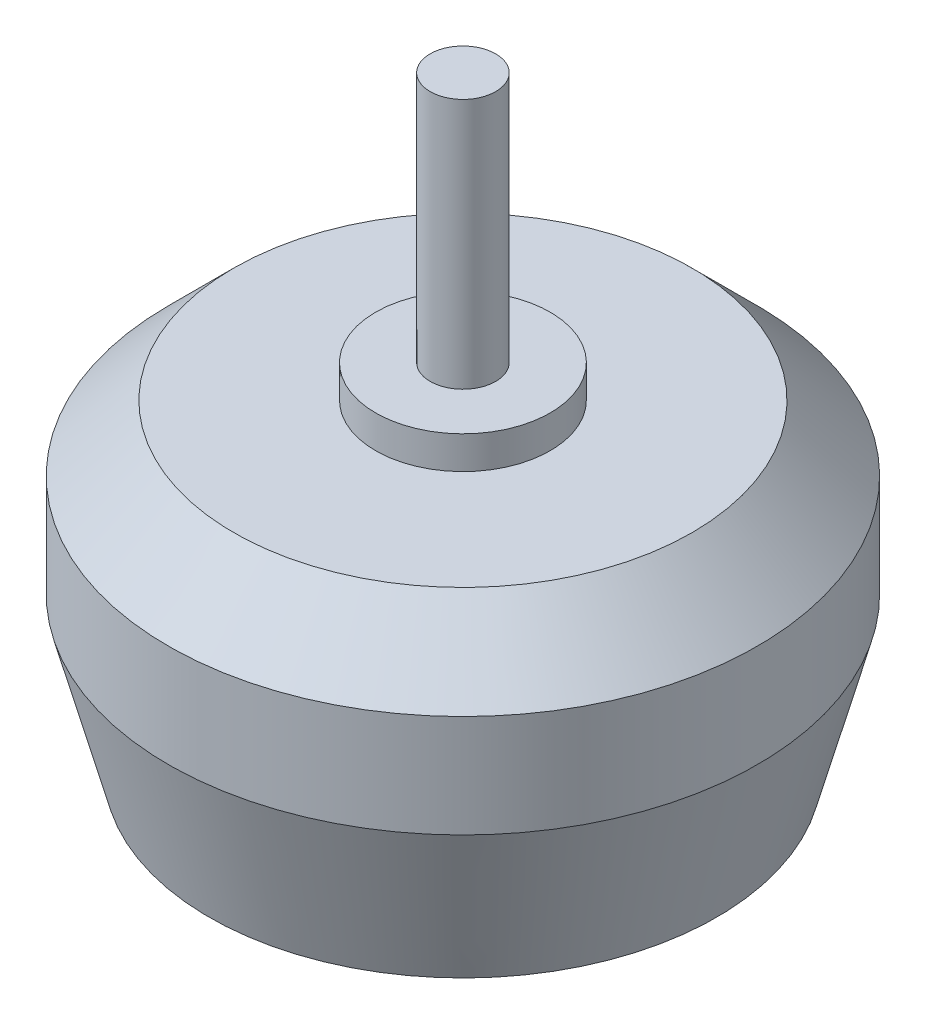
ISO-10303-21;
HEADER;
FILE_DESCRIPTION(('STEP AP214'),'2;1');
FILE_NAME('part.step','',(''),(''),'','','');
FILE_SCHEMA(('AUTOMOTIVE_DESIGN { 1 0 10303 214 1 1 1 1 }'));
ENDSEC;
DATA;
#1=APPLICATION_CONTEXT('core data for automotive mechanical design processes');
#2=APPLICATION_PROTOCOL_DEFINITION('international standard','automotive_design',2000,#1);
#3=PRODUCT_CONTEXT('',#1,'mechanical');
#4=PRODUCT('Part','Part','',(#3));
#5=PRODUCT_RELATED_PRODUCT_CATEGORY('part','',(#4));
#6=PRODUCT_DEFINITION_FORMATION('','',#4);
#7=PRODUCT_DEFINITION_CONTEXT('part definition',#1,'design');
#8=PRODUCT_DEFINITION('design','',#6,#7);
#9=PRODUCT_DEFINITION_SHAPE('','',#8);
#10=(LENGTH_UNIT() NAMED_UNIT(*) SI_UNIT(.MILLI.,.METRE.));
#11=(NAMED_UNIT(*) PLANE_ANGLE_UNIT() SI_UNIT($,.RADIAN.));
#12=(NAMED_UNIT(*) SI_UNIT($,.STERADIAN.) SOLID_ANGLE_UNIT());
#13=UNCERTAINTY_MEASURE_WITH_UNIT(LENGTH_MEASURE(1.E-05),#10,'distance_accuracy_value','');
#14=(GEOMETRIC_REPRESENTATION_CONTEXT(3) GLOBAL_UNCERTAINTY_ASSIGNED_CONTEXT((#13)) GLOBAL_UNIT_ASSIGNED_CONTEXT((#10,
#11,#12)) REPRESENTATION_CONTEXT('',''));
#15=CARTESIAN_POINT('',(0.,0.,0.));
#16=DIRECTION('',(0.,0.,1.));
#17=DIRECTION('',(1.,0.,0.));
#18=AXIS2_PLACEMENT_3D('',#15,#16,#17);
#19=CARTESIAN_POINT('',(0.,-2.1,0.));
#20=DIRECTION('',(0.,1.,0.));
#21=DIRECTION('',(-1.,0.,0.));
#22=AXIS2_PLACEMENT_3D('',#19,#20,#21);
#23=CYLINDRICAL_SURFACE('',#22,1.5);
#24=CARTESIAN_POINT('',(0.,0.,0.));
#25=DIRECTION('',(0.,1.,0.));
#26=DIRECTION('',(-1.,0.,0.));
#27=AXIS2_PLACEMENT_3D('',#24,#25,#26);
#28=CIRCLE('',#27,1.5);
#29=CARTESIAN_POINT('',(-1.5,0.,0.));
#30=VERTEX_POINT('',#29);
#31=EDGE_CURVE('E67',#30,#30,#28,.T.);
#32=ORIENTED_EDGE('',*,*,#31,.F.);
#33=EDGE_LOOP('',(#32));
#34=FACE_BOUND('',#33,.T.);
#35=CARTESIAN_POINT('',(0.,-2.1,0.));
#36=DIRECTION('',(0.,1.,0.));
#37=DIRECTION('',(-1.,0.,0.));
#38=AXIS2_PLACEMENT_3D('',#35,#36,#37);
#39=CIRCLE('',#38,1.5);
#40=CARTESIAN_POINT('',(-1.5,-2.1,0.));
#41=VERTEX_POINT('',#40);
#42=EDGE_CURVE('E10',#41,#41,#39,.T.);
#43=ORIENTED_EDGE('',*,*,#42,.T.);
#44=EDGE_LOOP('',(#43));
#45=FACE_BOUND('',#44,.T.);
#46=ADVANCED_FACE('F33',(#34,#45),#23,.T.);
#47=CARTESIAN_POINT('',(0.,-2.1,0.));
#48=DIRECTION('',(0.,1.,0.));
#49=DIRECTION('',(-1.,0.,0.));
#50=AXIS2_PLACEMENT_3D('',#47,#48,#49);
#51=PLANE('',#50);
#52=ORIENTED_EDGE('',*,*,#42,.F.);
#53=EDGE_LOOP('',(#52));
#54=FACE_BOUND('',#53,.T.);
#55=ADVANCED_FACE('F121',(#54),#51,.F.);
#56=CARTESIAN_POINT('',(1.5,27.7,0.));
#57=DIRECTION('',(0.,-1.,0.));
#58=DIRECTION('',(1.,0.,0.));
#59=AXIS2_PLACEMENT_3D('',#56,#57,#58);
#60=PLANE('',#59);
#61=CARTESIAN_POINT('',(0.,27.7,0.));
#62=DIRECTION('',(0.,1.,0.));
#63=DIRECTION('',(-1.,0.,0.));
#64=AXIS2_PLACEMENT_3D('',#61,#62,#63);
#65=CIRCLE('',#64,1.5);
#66=CARTESIAN_POINT('',(-1.5,27.7,0.));
#67=VERTEX_POINT('',#66);
#68=EDGE_CURVE('E39',#67,#67,#65,.T.);
#69=ORIENTED_EDGE('',*,*,#68,.T.);
#70=EDGE_LOOP('',(#69));
#71=FACE_BOUND('',#70,.T.);
#72=ADVANCED_FACE('F125',(#71),#60,.F.);
#73=CARTESIAN_POINT('',(0.,-2.1,0.));
#74=DIRECTION('',(0.,1.,0.));
#75=DIRECTION('',(-1.,0.,0.));
#76=AXIS2_PLACEMENT_3D('',#73,#74,#75);
#77=CYLINDRICAL_SURFACE('',#76,1.5);
#78=ORIENTED_EDGE('',*,*,#68,.F.);
#79=EDGE_LOOP('',(#78));
#80=FACE_BOUND('',#79,.T.);
#81=CARTESIAN_POINT('',(0.,16.2,0.));
#82=DIRECTION('',(0.,1.,0.));
#83=DIRECTION('',(-1.,0.,0.));
#84=AXIS2_PLACEMENT_3D('',#81,#82,#83);
#85=CIRCLE('',#84,1.5);
#86=CARTESIAN_POINT('',(-1.5,16.2,0.));
#87=VERTEX_POINT('',#86);
#88=EDGE_CURVE('E43',#87,#87,#85,.T.);
#89=ORIENTED_EDGE('',*,*,#88,.T.);
#90=EDGE_LOOP('',(#89));
#91=FACE_BOUND('',#90,.T.);
#92=ADVANCED_FACE('F130',(#80,#91),#77,.T.);
#93=CARTESIAN_POINT('',(4.,16.2,0.));
#94=DIRECTION('',(0.,-1.,0.));
#95=DIRECTION('',(1.,0.,0.));
#96=AXIS2_PLACEMENT_3D('',#93,#94,#95);
#97=PLANE('',#96);
#98=ORIENTED_EDGE('',*,*,#88,.F.);
#99=EDGE_LOOP('',(#98));
#100=FACE_BOUND('',#99,.T.);
#101=CARTESIAN_POINT('',(0.,16.2,0.));
#102=DIRECTION('',(0.,1.,0.));
#103=DIRECTION('',(-1.,0.,0.));
#104=AXIS2_PLACEMENT_3D('',#101,#102,#103);
#105=CIRCLE('',#104,4.);
#106=CARTESIAN_POINT('',(-4.,16.2,0.));
#107=VERTEX_POINT('',#106);
#108=EDGE_CURVE('E47',#107,#107,#105,.T.);
#109=ORIENTED_EDGE('',*,*,#108,.T.);
#110=EDGE_LOOP('',(#109));
#111=FACE_BOUND('',#110,.T.);
#112=ADVANCED_FACE('F135',(#100,#111),#97,.F.);
#113=CARTESIAN_POINT('',(0.,-2.1,0.));
#114=DIRECTION('',(0.,1.,0.));
#115=DIRECTION('',(-1.,0.,0.));
#116=AXIS2_PLACEMENT_3D('',#113,#114,#115);
#117=CYLINDRICAL_SURFACE('',#116,4.);
#118=ORIENTED_EDGE('',*,*,#108,.F.);
#119=EDGE_LOOP('',(#118));
#120=FACE_BOUND('',#119,.T.);
#121=CARTESIAN_POINT('',(0.,14.7,0.));
#122=DIRECTION('',(0.,1.,0.));
#123=DIRECTION('',(-1.,0.,0.));
#124=AXIS2_PLACEMENT_3D('',#121,#122,#123);
#125=CIRCLE('',#124,4.);
#126=CARTESIAN_POINT('',(-4.,14.7,0.));
#127=VERTEX_POINT('',#126);
#128=EDGE_CURVE('E52',#127,#127,#125,.T.);
#129=ORIENTED_EDGE('',*,*,#128,.T.);
#130=EDGE_LOOP('',(#129));
#131=FACE_BOUND('',#130,.T.);
#132=ADVANCED_FACE('F139',(#120,#131),#117,.T.);
#133=CARTESIAN_POINT('',(10.5,14.7,0.));
#134=DIRECTION('',(0.,-1.,0.));
#135=DIRECTION('',(1.,0.,0.));
#136=AXIS2_PLACEMENT_3D('',#133,#134,#135);
#137=PLANE('',#136);
#138=ORIENTED_EDGE('',*,*,#128,.F.);
#139=EDGE_LOOP('',(#138));
#140=FACE_BOUND('',#139,.T.);
#141=CARTESIAN_POINT('',(0.,14.7,0.));
#142=DIRECTION('',(0.,1.,0.));
#143=DIRECTION('',(-1.,0.,0.));
#144=AXIS2_PLACEMENT_3D('',#141,#142,#143);
#145=CIRCLE('',#144,10.5);
#146=CARTESIAN_POINT('',(-10.5,14.7,0.));
#147=VERTEX_POINT('',#146);
#148=EDGE_CURVE('E55',#147,#147,#145,.T.);
#149=ORIENTED_EDGE('',*,*,#148,.T.);
#150=EDGE_LOOP('',(#149));
#151=FACE_BOUND('',#150,.T.);
#152=ADVANCED_FACE('F143',(#140,#151),#137,.F.);
#153=CARTESIAN_POINT('',(0.,11.7,0.));
#154=DIRECTION('',(0.,-1.,0.));
#155=DIRECTION('',(1.,0.,0.));
#156=AXIS2_PLACEMENT_3D('',#153,#154,#155);
#157=CONICAL_SURFACE('',#156,13.5,0.78539816339745);
#158=ORIENTED_EDGE('',*,*,#148,.F.);
#159=EDGE_LOOP('',(#158));
#160=FACE_BOUND('',#159,.T.);
#161=CARTESIAN_POINT('',(0.,11.7,0.));
#162=DIRECTION('',(0.,1.,0.));
#163=DIRECTION('',(-1.,0.,0.));
#164=AXIS2_PLACEMENT_3D('',#161,#162,#163);
#165=CIRCLE('',#164,13.5);
#166=CARTESIAN_POINT('',(-13.5,11.7,0.));
#167=VERTEX_POINT('',#166);
#168=EDGE_CURVE('E58',#167,#167,#165,.T.);
#169=ORIENTED_EDGE('',*,*,#168,.T.);
#170=EDGE_LOOP('',(#169));
#171=FACE_BOUND('',#170,.T.);
#172=ADVANCED_FACE('F147',(#160,#171),#157,.T.);
#173=CARTESIAN_POINT('',(0.,-2.1,0.));
#174=DIRECTION('',(0.,1.,0.));
#175=DIRECTION('',(-1.,0.,0.));
#176=AXIS2_PLACEMENT_3D('',#173,#174,#175);
#177=CYLINDRICAL_SURFACE('',#176,13.5);
#178=ORIENTED_EDGE('',*,*,#168,.F.);
#179=EDGE_LOOP('',(#178));
#180=FACE_BOUND('',#179,.T.);
#181=CARTESIAN_POINT('',(0.,7.,0.));
#182=DIRECTION('',(0.,1.,0.));
#183=DIRECTION('',(-1.,0.,0.));
#184=AXIS2_PLACEMENT_3D('',#181,#182,#183);
#185=CIRCLE('',#184,13.5);
#186=CARTESIAN_POINT('',(-13.5,7.,0.));
#187=VERTEX_POINT('',#186);
#188=EDGE_CURVE('E61',#187,#187,#185,.T.);
#189=ORIENTED_EDGE('',*,*,#188,.T.);
#190=EDGE_LOOP('',(#189));
#191=FACE_BOUND('',#190,.T.);
#192=ADVANCED_FACE('F151',(#180,#191),#177,.T.);
#193=CARTESIAN_POINT('',(0.,0.,0.));
#194=DIRECTION('',(0.,1.,0.));
#195=DIRECTION('',(-1.,0.,0.));
#196=AXIS2_PLACEMENT_3D('',#193,#194,#195);
#197=CONICAL_SURFACE('',#196,11.6243556529822,0.261799387799146);
#198=ORIENTED_EDGE('',*,*,#188,.F.);
#199=EDGE_LOOP('',(#198));
#200=FACE_BOUND('',#199,.T.);
#201=CARTESIAN_POINT('',(0.,0.,0.));
#202=DIRECTION('',(0.,1.,0.));
#203=DIRECTION('',(-1.,0.,0.));
#204=AXIS2_PLACEMENT_3D('',#201,#202,#203);
#205=CIRCLE('',#204,11.6243556529822);
#206=CARTESIAN_POINT('',(-11.6243556529822,0.,0.));
#207=VERTEX_POINT('',#206);
#208=EDGE_CURVE('E64',#207,#207,#205,.T.);
#209=ORIENTED_EDGE('',*,*,#208,.T.);
#210=EDGE_LOOP('',(#209));
#211=FACE_BOUND('',#210,.T.);
#212=ADVANCED_FACE('F108',(#200,#211),#197,.T.);
#213=CARTESIAN_POINT('',(1.5,0.,0.));
#214=DIRECTION('',(0.,1.,0.));
#215=DIRECTION('',(-1.,0.,0.));
#216=AXIS2_PLACEMENT_3D('',#213,#214,#215);
#217=PLANE('',#216);
#218=CARTESIAN_POINT('',(8.,0.,0.));
#219=DIRECTION('',(0.,-1.,0.));
#220=DIRECTION('',(1.,0.,0.));
#221=AXIS2_PLACEMENT_3D('',#218,#219,#220);
#222=CIRCLE('',#221,1.375);
#223=CARTESIAN_POINT('',(9.375,0.,0.));
#224=VERTEX_POINT('',#223);
#225=EDGE_CURVE('E89',#224,#224,#222,.T.);
#226=ORIENTED_EDGE('',*,*,#225,.F.);
#227=EDGE_LOOP('',(#226));
#228=FACE_BOUND('',#227,.T.);
#229=CARTESIAN_POINT('',(-8.,0.,0.));
#230=DIRECTION('',(0.,-1.,0.));
#231=DIRECTION('',(1.,0.,0.));
#232=AXIS2_PLACEMENT_3D('',#229,#230,#231);
#233=CIRCLE('',#232,1.375);
#234=CARTESIAN_POINT('',(-6.625,0.,0.));
#235=VERTEX_POINT('',#234);
#236=EDGE_CURVE('E83',#235,#235,#233,.T.);
#237=ORIENTED_EDGE('',*,*,#236,.F.);
#238=EDGE_LOOP('',(#237));
#239=FACE_BOUND('',#238,.T.);
#240=CARTESIAN_POINT('',(0.,0.,-9.5));
#241=DIRECTION('',(0.,-1.,0.));
#242=DIRECTION('',(1.,0.,0.));
#243=AXIS2_PLACEMENT_3D('',#240,#241,#242);
#244=CIRCLE('',#243,1.375);
#245=CARTESIAN_POINT('',(1.375,0.,-9.5));
#246=VERTEX_POINT('',#245);
#247=EDGE_CURVE('E77',#246,#246,#244,.T.);
#248=ORIENTED_EDGE('',*,*,#247,.F.);
#249=EDGE_LOOP('',(#248));
#250=FACE_BOUND('',#249,.T.);
#251=CARTESIAN_POINT('',(0.,0.,9.5));
#252=DIRECTION('',(0.,-1.,0.));
#253=DIRECTION('',(1.,0.,0.));
#254=AXIS2_PLACEMENT_3D('',#251,#252,#253);
#255=CIRCLE('',#254,1.375);
#256=CARTESIAN_POINT('',(1.375,0.,9.5));
#257=VERTEX_POINT('',#256);
#258=EDGE_CURVE('E71',#257,#257,#255,.T.);
#259=ORIENTED_EDGE('',*,*,#258,.F.);
#260=EDGE_LOOP('',(#259));
#261=FACE_BOUND('',#260,.T.);
#262=ORIENTED_EDGE('',*,*,#208,.F.);
#263=EDGE_LOOP('',(#262));
#264=FACE_BOUND('',#263,.T.);
#265=ORIENTED_EDGE('',*,*,#31,.T.);
#266=EDGE_LOOP('',(#265));
#267=FACE_BOUND('',#266,.T.);
#268=ADVANCED_FACE('F104',(#228,#239,#250,#261,#264,#267),#217,.F.);
#269=CARTESIAN_POINT('',(0.,2.,9.5));
#270=DIRECTION('',(0.,-1.,0.));
#271=DIRECTION('',(1.,0.,0.));
#272=AXIS2_PLACEMENT_3D('',#269,#270,#271);
#273=CYLINDRICAL_SURFACE('',#272,1.375);
#274=CARTESIAN_POINT('',(0.,2.,9.5));
#275=DIRECTION('',(0.,-1.,0.));
#276=DIRECTION('',(1.,0.,0.));
#277=AXIS2_PLACEMENT_3D('',#274,#275,#276);
#278=CIRCLE('',#277,1.375);
#279=CARTESIAN_POINT('',(1.375,2.,9.5));
#280=VERTEX_POINT('',#279);
#281=EDGE_CURVE('E70',#280,#280,#278,.T.);
#282=ORIENTED_EDGE('',*,*,#281,.F.);
#283=EDGE_LOOP('',(#282));
#284=FACE_BOUND('',#283,.T.);
#285=ORIENTED_EDGE('',*,*,#258,.T.);
#286=EDGE_LOOP('',(#285));
#287=FACE_BOUND('',#286,.T.);
#288=ADVANCED_FACE('F107',(#284,#287),#273,.F.);
#289=CARTESIAN_POINT('',(0.,2.,9.5));
#290=DIRECTION('',(0.,-1.,0.));
#291=DIRECTION('',(1.,0.,0.));
#292=AXIS2_PLACEMENT_3D('',#289,#290,#291);
#293=PLANE('',#292);
#294=ORIENTED_EDGE('',*,*,#281,.T.);
#295=EDGE_LOOP('',(#294));
#296=FACE_BOUND('',#295,.T.);
#297=ADVANCED_FACE('F161',(#296),#293,.T.);
#298=CARTESIAN_POINT('',(0.,2.,-9.5));
#299=DIRECTION('',(0.,-1.,0.));
#300=DIRECTION('',(1.,0.,0.));
#301=AXIS2_PLACEMENT_3D('',#298,#299,#300);
#302=CYLINDRICAL_SURFACE('',#301,1.375);
#303=CARTESIAN_POINT('',(0.,2.,-9.5));
#304=DIRECTION('',(0.,-1.,0.));
#305=DIRECTION('',(1.,0.,0.));
#306=AXIS2_PLACEMENT_3D('',#303,#304,#305);
#307=CIRCLE('',#306,1.375);
#308=CARTESIAN_POINT('',(1.375,2.,-9.5));
#309=VERTEX_POINT('',#308);
#310=EDGE_CURVE('E74',#309,#309,#307,.T.);
#311=ORIENTED_EDGE('',*,*,#310,.F.);
#312=EDGE_LOOP('',(#311));
#313=FACE_BOUND('',#312,.T.);
#314=ORIENTED_EDGE('',*,*,#247,.T.);
#315=EDGE_LOOP('',(#314));
#316=FACE_BOUND('',#315,.T.);
#317=ADVANCED_FACE('F165',(#313,#316),#302,.F.);
#318=CARTESIAN_POINT('',(0.,2.,-9.5));
#319=DIRECTION('',(0.,-1.,0.));
#320=DIRECTION('',(1.,0.,0.));
#321=AXIS2_PLACEMENT_3D('',#318,#319,#320);
#322=PLANE('',#321);
#323=ORIENTED_EDGE('',*,*,#310,.T.);
#324=EDGE_LOOP('',(#323));
#325=FACE_BOUND('',#324,.T.);
#326=ADVANCED_FACE('F169',(#325),#322,.T.);
#327=CARTESIAN_POINT('',(-8.,2.,0.));
#328=DIRECTION('',(0.,-1.,0.));
#329=DIRECTION('',(1.,0.,0.));
#330=AXIS2_PLACEMENT_3D('',#327,#328,#329);
#331=CYLINDRICAL_SURFACE('',#330,1.375);
#332=CARTESIAN_POINT('',(-8.,2.,0.));
#333=DIRECTION('',(0.,-1.,0.));
#334=DIRECTION('',(1.,0.,0.));
#335=AXIS2_PLACEMENT_3D('',#332,#333,#334);
#336=CIRCLE('',#335,1.375);
#337=CARTESIAN_POINT('',(-6.625,2.,0.));
#338=VERTEX_POINT('',#337);
#339=EDGE_CURVE('E80',#338,#338,#336,.T.);
#340=ORIENTED_EDGE('',*,*,#339,.F.);
#341=EDGE_LOOP('',(#340));
#342=FACE_BOUND('',#341,.T.);
#343=ORIENTED_EDGE('',*,*,#236,.T.);
#344=EDGE_LOOP('',(#343));
#345=FACE_BOUND('',#344,.T.);
#346=ADVANCED_FACE('F173',(#342,#345),#331,.F.);
#347=CARTESIAN_POINT('',(-8.,2.,0.));
#348=DIRECTION('',(0.,-1.,0.));
#349=DIRECTION('',(1.,0.,0.));
#350=AXIS2_PLACEMENT_3D('',#347,#348,#349);
#351=PLANE('',#350);
#352=ORIENTED_EDGE('',*,*,#339,.T.);
#353=EDGE_LOOP('',(#352));
#354=FACE_BOUND('',#353,.T.);
#355=ADVANCED_FACE('F100',(#354),#351,.T.);
#356=CARTESIAN_POINT('',(8.,2.,0.));
#357=DIRECTION('',(0.,-1.,0.));
#358=DIRECTION('',(1.,0.,0.));
#359=AXIS2_PLACEMENT_3D('',#356,#357,#358);
#360=CYLINDRICAL_SURFACE('',#359,1.375);
#361=CARTESIAN_POINT('',(8.,2.,0.));
#362=DIRECTION('',(0.,-1.,0.));
#363=DIRECTION('',(1.,0.,0.));
#364=AXIS2_PLACEMENT_3D('',#361,#362,#363);
#365=CIRCLE('',#364,1.375);
#366=CARTESIAN_POINT('',(9.375,2.,0.));
#367=VERTEX_POINT('',#366);
#368=EDGE_CURVE('E86',#367,#367,#365,.T.);
#369=ORIENTED_EDGE('',*,*,#368,.F.);
#370=EDGE_LOOP('',(#369));
#371=FACE_BOUND('',#370,.T.);
#372=ORIENTED_EDGE('',*,*,#225,.T.);
#373=EDGE_LOOP('',(#372));
#374=FACE_BOUND('',#373,.T.);
#375=ADVANCED_FACE('F97',(#371,#374),#360,.F.);
#376=CARTESIAN_POINT('',(8.,2.,0.));
#377=DIRECTION('',(0.,-1.,0.));
#378=DIRECTION('',(1.,0.,0.));
#379=AXIS2_PLACEMENT_3D('',#376,#377,#378);
#380=PLANE('',#379);
#381=ORIENTED_EDGE('',*,*,#368,.T.);
#382=EDGE_LOOP('',(#381));
#383=FACE_BOUND('',#382,.T.);
#384=ADVANCED_FACE('F95',(#383),#380,.T.);
#385=CLOSED_SHELL('',(#46,#55,#72,#92,#112,#132,#152,#172,#192,#212,#268,#288,#297,#317,#326,
#346,#355,#375,#384));
#386=MANIFOLD_SOLID_BREP('B2',#385);
#387=ADVANCED_BREP_SHAPE_REPRESENTATION('',(#18,#386),#14);
#388=SHAPE_DEFINITION_REPRESENTATION(#9,#387);
ENDSEC;
END-ISO-10303-21;
